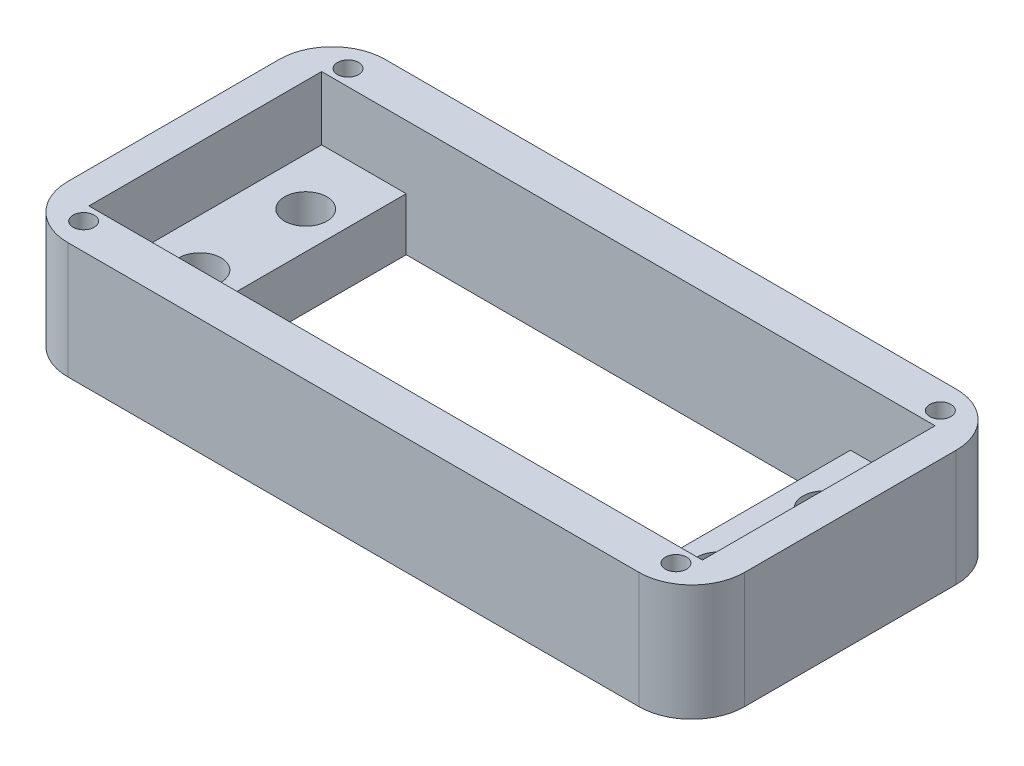
ISO-10303-21;
HEADER;
FILE_DESCRIPTION(('STEP AP214'),'2;1');
FILE_NAME('part.step','',(''),(''),'','','');
FILE_SCHEMA(('AUTOMOTIVE_DESIGN { 1 0 10303 214 1 1 1 1 }'));
ENDSEC;
DATA;
#1=APPLICATION_CONTEXT('core data for automotive mechanical design processes');
#2=APPLICATION_PROTOCOL_DEFINITION('international standard','automotive_design',2000,#1);
#3=PRODUCT_CONTEXT('',#1,'mechanical');
#4=PRODUCT('Part','Part','',(#3));
#5=PRODUCT_RELATED_PRODUCT_CATEGORY('part','',(#4));
#6=PRODUCT_DEFINITION_FORMATION('','',#4);
#7=PRODUCT_DEFINITION_CONTEXT('part definition',#1,'design');
#8=PRODUCT_DEFINITION('design','',#6,#7);
#9=PRODUCT_DEFINITION_SHAPE('','',#8);
#10=(LENGTH_UNIT() NAMED_UNIT(*) SI_UNIT(.MILLI.,.METRE.));
#11=(NAMED_UNIT(*) PLANE_ANGLE_UNIT() SI_UNIT($,.RADIAN.));
#12=(NAMED_UNIT(*) SI_UNIT($,.STERADIAN.) SOLID_ANGLE_UNIT());
#13=UNCERTAINTY_MEASURE_WITH_UNIT(LENGTH_MEASURE(1.E-05),#10,'distance_accuracy_value','');
#14=(GEOMETRIC_REPRESENTATION_CONTEXT(3) GLOBAL_UNCERTAINTY_ASSIGNED_CONTEXT((#13)) GLOBAL_UNIT_ASSIGNED_CONTEXT((#10,
#11,#12)) REPRESENTATION_CONTEXT('',''));
#15=CARTESIAN_POINT('',(0.,0.,0.));
#16=DIRECTION('',(0.,0.,1.));
#17=DIRECTION('',(1.,0.,0.));
#18=AXIS2_PLACEMENT_3D('',#15,#16,#17);
#19=CARTESIAN_POINT('',(0.,64.,0.));
#20=DIRECTION('',(1.,0.,0.));
#21=DIRECTION('',(0.,0.,-1.));
#22=AXIS2_PLACEMENT_3D('',#19,#20,#21);
#23=PLANE('',#22);
#24=DIRECTION('',(0.,0.,1.));
#25=VECTOR('',#24,1.);
#26=CARTESIAN_POINT('',(0.,70.,-25.));
#27=LINE('',#26,#25);
#28=CARTESIAN_POINT('',(0.,70.,-25.));
#29=VERTEX_POINT('',#28);
#30=CARTESIAN_POINT('',(0.,70.,-5.));
#31=VERTEX_POINT('',#30);
#32=EDGE_CURVE('E60',#29,#31,#27,.T.);
#33=ORIENTED_EDGE('',*,*,#32,.F.);
#34=DIRECTION('',(0.,-1.,0.));
#35=VECTOR('',#34,1.);
#36=CARTESIAN_POINT('',(0.,64.,-25.));
#37=LINE('',#36,#35);
#38=CARTESIAN_POINT('',(0.,59.,-25.));
#39=VERTEX_POINT('',#38);
#40=EDGE_CURVE('E53',#29,#39,#37,.T.);
#41=ORIENTED_EDGE('',*,*,#40,.T.);
#42=DIRECTION('',(0.,0.,1.));
#43=VECTOR('',#42,1.);
#44=CARTESIAN_POINT('',(0.,59.,-5.));
#45=LINE('',#44,#43);
#46=CARTESIAN_POINT('',(0.,59.,-5.));
#47=VERTEX_POINT('',#46);
#48=EDGE_CURVE('E198',#39,#47,#45,.T.);
#49=ORIENTED_EDGE('',*,*,#48,.T.);
#50=DIRECTION('',(0.,-1.,0.));
#51=VECTOR('',#50,1.);
#52=CARTESIAN_POINT('',(0.,64.,-5.));
#53=LINE('',#52,#51);
#54=EDGE_CURVE('E192',#47,#31,#53,.F.);
#55=ORIENTED_EDGE('',*,*,#54,.T.);
#56=EDGE_LOOP('',(#33,#41,#49,#55));
#57=FACE_BOUND('',#56,.T.);
#58=ADVANCED_FACE('F45',(#57),#23,.F.);
#59=CARTESIAN_POINT('',(0.,64.,0.));
#60=DIRECTION('',(0.,0.,-1.));
#61=DIRECTION('',(-1.,0.,0.));
#62=AXIS2_PLACEMENT_3D('',#59,#60,#61);
#63=PLANE('',#62);
#64=DIRECTION('',(1.,0.,0.));
#65=VECTOR('',#64,1.);
#66=CARTESIAN_POINT('',(5.,70.,0.));
#67=LINE('',#66,#65);
#68=CARTESIAN_POINT('',(5.,70.,0.));
#69=VERTEX_POINT('',#68);
#70=CARTESIAN_POINT('',(59.,70.,0.));
#71=VERTEX_POINT('',#70);
#72=EDGE_CURVE('E162',#69,#71,#67,.T.);
#73=ORIENTED_EDGE('',*,*,#72,.F.);
#74=DIRECTION('',(0.,-1.,0.));
#75=VECTOR('',#74,1.);
#76=CARTESIAN_POINT('',(5.,64.,0.));
#77=LINE('',#76,#75);
#78=CARTESIAN_POINT('',(5.,59.,0.));
#79=VERTEX_POINT('',#78);
#80=EDGE_CURVE('E183',#69,#79,#77,.T.);
#81=ORIENTED_EDGE('',*,*,#80,.T.);
#82=DIRECTION('',(1.,0.,0.));
#83=VECTOR('',#82,1.);
#84=CARTESIAN_POINT('',(59.,59.,0.));
#85=LINE('',#84,#83);
#86=CARTESIAN_POINT('',(59.,59.,0.));
#87=VERTEX_POINT('',#86);
#88=EDGE_CURVE('E369',#79,#87,#85,.T.);
#89=ORIENTED_EDGE('',*,*,#88,.T.);
#90=DIRECTION('',(0.,-1.,0.));
#91=VECTOR('',#90,1.);
#92=CARTESIAN_POINT('',(59.,64.,0.));
#93=LINE('',#92,#91);
#94=EDGE_CURVE('E190',#87,#71,#93,.F.);
#95=ORIENTED_EDGE('',*,*,#94,.T.);
#96=EDGE_LOOP('',(#73,#81,#89,#95));
#97=FACE_BOUND('',#96,.T.);
#98=ADVANCED_FACE('F384',(#97),#63,.F.);
#99=CARTESIAN_POINT('',(64.,64.,0.));
#100=DIRECTION('',(-1.,0.,0.));
#101=DIRECTION('',(0.,0.,1.));
#102=AXIS2_PLACEMENT_3D('',#99,#100,#101);
#103=PLANE('',#102);
#104=DIRECTION('',(0.,0.,-1.));
#105=VECTOR('',#104,1.);
#106=CARTESIAN_POINT('',(64.,70.,-5.));
#107=LINE('',#106,#105);
#108=CARTESIAN_POINT('',(64.,70.,-5.));
#109=VERTEX_POINT('',#108);
#110=CARTESIAN_POINT('',(64.,70.,-25.));
#111=VERTEX_POINT('',#110);
#112=EDGE_CURVE('E159',#109,#111,#107,.T.);
#113=ORIENTED_EDGE('',*,*,#112,.F.);
#114=DIRECTION('',(0.,-1.,0.));
#115=VECTOR('',#114,1.);
#116=CARTESIAN_POINT('',(64.,64.,-5.));
#117=LINE('',#116,#115);
#118=CARTESIAN_POINT('',(64.,59.,-5.));
#119=VERTEX_POINT('',#118);
#120=EDGE_CURVE('E172',#109,#119,#117,.T.);
#121=ORIENTED_EDGE('',*,*,#120,.T.);
#122=DIRECTION('',(0.,0.,-1.));
#123=VECTOR('',#122,1.);
#124=CARTESIAN_POINT('',(64.,59.,-25.));
#125=LINE('',#124,#123);
#126=CARTESIAN_POINT('',(64.,59.,-25.));
#127=VERTEX_POINT('',#126);
#128=EDGE_CURVE('E366',#119,#127,#125,.T.);
#129=ORIENTED_EDGE('',*,*,#128,.T.);
#130=DIRECTION('',(0.,-1.,0.));
#131=VECTOR('',#130,1.);
#132=CARTESIAN_POINT('',(64.,64.,-25.));
#133=LINE('',#132,#131);
#134=EDGE_CURVE('E175',#127,#111,#133,.F.);
#135=ORIENTED_EDGE('',*,*,#134,.T.);
#136=EDGE_LOOP('',(#113,#121,#129,#135));
#137=FACE_BOUND('',#136,.T.);
#138=ADVANCED_FACE('F170',(#137),#103,.F.);
#139=CARTESIAN_POINT('',(0.,64.,-30.));
#140=DIRECTION('',(0.,0.,1.));
#141=DIRECTION('',(1.,0.,0.));
#142=AXIS2_PLACEMENT_3D('',#139,#140,#141);
#143=PLANE('',#142);
#144=DIRECTION('',(-1.,0.,0.));
#145=VECTOR('',#144,1.);
#146=CARTESIAN_POINT('',(59.,70.,-30.));
#147=LINE('',#146,#145);
#148=CARTESIAN_POINT('',(59.,70.,-30.));
#149=VERTEX_POINT('',#148);
#150=CARTESIAN_POINT('',(5.,70.,-30.));
#151=VERTEX_POINT('',#150);
#152=EDGE_CURVE('E377',#149,#151,#147,.T.);
#153=ORIENTED_EDGE('',*,*,#152,.F.);
#154=DIRECTION('',(0.,-1.,0.));
#155=VECTOR('',#154,1.);
#156=CARTESIAN_POINT('',(59.,64.,-30.));
#157=LINE('',#156,#155);
#158=CARTESIAN_POINT('',(59.,59.,-30.));
#159=VERTEX_POINT('',#158);
#160=EDGE_CURVE('E181',#149,#159,#157,.T.);
#161=ORIENTED_EDGE('',*,*,#160,.T.);
#162=DIRECTION('',(-1.,0.,0.));
#163=VECTOR('',#162,1.);
#164=CARTESIAN_POINT('',(5.,59.,-30.));
#165=LINE('',#164,#163);
#166=CARTESIAN_POINT('',(5.,59.,-30.));
#167=VERTEX_POINT('',#166);
#168=EDGE_CURVE('E216',#159,#167,#165,.T.);
#169=ORIENTED_EDGE('',*,*,#168,.T.);
#170=DIRECTION('',(0.,-1.,0.));
#171=VECTOR('',#170,1.);
#172=CARTESIAN_POINT('',(5.,64.,-30.));
#173=LINE('',#172,#171);
#174=EDGE_CURVE('E185',#167,#151,#173,.F.);
#175=ORIENTED_EDGE('',*,*,#174,.T.);
#176=EDGE_LOOP('',(#153,#161,#169,#175));
#177=FACE_BOUND('',#176,.T.);
#178=ADVANCED_FACE('F381',(#177),#143,.F.);
#179=CARTESIAN_POINT('',(11.,-0.001000000000001,-26.));
#180=DIRECTION('',(0.,0.,-1.));
#181=DIRECTION('',(-1.,0.,0.));
#182=AXIS2_PLACEMENT_3D('',#179,#180,#181);
#183=PLANE('',#182);
#184=DIRECTION('',(1.,0.,0.));
#185=VECTOR('',#184,1.);
#186=CARTESIAN_POINT('',(11.,70.,-26.));
#187=LINE('',#186,#185);
#188=CARTESIAN_POINT('',(3.,70.,-26.));
#189=VERTEX_POINT('',#188);
#190=CARTESIAN_POINT('',(61.,70.,-26.));
#191=VERTEX_POINT('',#190);
#192=EDGE_CURVE('E68',#189,#191,#187,.T.);
#193=ORIENTED_EDGE('',*,*,#192,.F.);
#194=DIRECTION('',(0.,-1.,0.));
#195=VECTOR('',#194,1.);
#196=CARTESIAN_POINT('',(3.,76.,-26.));
#197=LINE('',#196,#195);
#198=CARTESIAN_POINT('',(3.,64.,-26.));
#199=VERTEX_POINT('',#198);
#200=EDGE_CURVE('E266',#189,#199,#197,.T.);
#201=ORIENTED_EDGE('',*,*,#200,.T.);
#202=DIRECTION('',(-1.,0.,0.));
#203=VECTOR('',#202,1.);
#204=CARTESIAN_POINT('',(3.,64.,-26.));
#205=LINE('',#204,#203);
#206=CARTESIAN_POINT('',(11.,64.,-26.));
#207=VERTEX_POINT('',#206);
#208=EDGE_CURVE('E267',#207,#199,#205,.T.);
#209=ORIENTED_EDGE('',*,*,#208,.F.);
#210=DIRECTION('',(0.,1.,0.));
#211=VECTOR('',#210,1.);
#212=CARTESIAN_POINT('',(11.,-0.001000000000001,-26.));
#213=LINE('',#212,#211);
#214=CARTESIAN_POINT('',(11.,59.,-26.));
#215=VERTEX_POINT('',#214);
#216=EDGE_CURVE('E294',#215,#207,#213,.T.);
#217=ORIENTED_EDGE('',*,*,#216,.F.);
#218=DIRECTION('',(-1.,0.,0.));
#219=VECTOR('',#218,1.);
#220=CARTESIAN_POINT('',(11.,59.,-26.));
#221=LINE('',#220,#219);
#222=CARTESIAN_POINT('',(53.,59.,-26.));
#223=VERTEX_POINT('',#222);
#224=EDGE_CURVE('E249',#223,#215,#221,.T.);
#225=ORIENTED_EDGE('',*,*,#224,.F.);
#226=DIRECTION('',(0.,1.,0.));
#227=VECTOR('',#226,1.);
#228=CARTESIAN_POINT('',(53.,-0.001000000000001,-26.));
#229=LINE('',#228,#227);
#230=CARTESIAN_POINT('',(53.,64.,-26.));
#231=VERTEX_POINT('',#230);
#232=EDGE_CURVE('E296',#223,#231,#229,.T.);
#233=ORIENTED_EDGE('',*,*,#232,.T.);
#234=CARTESIAN_POINT('',(61.,64.,-26.));
#235=VERTEX_POINT('',#234);
#236=EDGE_CURVE('E263',#235,#231,#205,.T.);
#237=ORIENTED_EDGE('',*,*,#236,.F.);
#238=DIRECTION('',(0.,-1.,0.));
#239=VECTOR('',#238,1.);
#240=CARTESIAN_POINT('',(61.,76.,-26.));
#241=LINE('',#240,#239);
#242=EDGE_CURVE('E269',#191,#235,#241,.T.);
#243=ORIENTED_EDGE('',*,*,#242,.F.);
#244=EDGE_LOOP('',(#193,#201,#209,#217,#225,#233,#237,#243));
#245=FACE_BOUND('',#244,.T.);
#246=ADVANCED_FACE('F314',(#245),#183,.F.);
#247=CARTESIAN_POINT('',(11.,-0.001000000000001,-4.));
#248=DIRECTION('',(0.,0.,1.));
#249=DIRECTION('',(1.,0.,0.));
#250=AXIS2_PLACEMENT_3D('',#247,#248,#249);
#251=PLANE('',#250);
#252=DIRECTION('',(-1.,0.,0.));
#253=VECTOR('',#252,1.);
#254=CARTESIAN_POINT('',(11.,70.,-4.));
#255=LINE('',#254,#253);
#256=CARTESIAN_POINT('',(61.,70.,-4.));
#257=VERTEX_POINT('',#256);
#258=CARTESIAN_POINT('',(3.,70.,-4.));
#259=VERTEX_POINT('',#258);
#260=EDGE_CURVE('E343',#257,#259,#255,.T.);
#261=ORIENTED_EDGE('',*,*,#260,.F.);
#262=DIRECTION('',(0.,-1.,0.));
#263=VECTOR('',#262,1.);
#264=CARTESIAN_POINT('',(61.,76.,-4.));
#265=LINE('',#264,#263);
#266=CARTESIAN_POINT('',(61.,64.,-4.));
#267=VERTEX_POINT('',#266);
#268=EDGE_CURVE('E271',#257,#267,#265,.T.);
#269=ORIENTED_EDGE('',*,*,#268,.T.);
#270=DIRECTION('',(1.,0.,0.));
#271=VECTOR('',#270,1.);
#272=CARTESIAN_POINT('',(3.,64.,-4.));
#273=LINE('',#272,#271);
#274=CARTESIAN_POINT('',(53.,64.,-4.));
#275=VERTEX_POINT('',#274);
#276=EDGE_CURVE('E260',#275,#267,#273,.T.);
#277=ORIENTED_EDGE('',*,*,#276,.F.);
#278=DIRECTION('',(0.,1.,0.));
#279=VECTOR('',#278,1.);
#280=CARTESIAN_POINT('',(53.,-0.001000000000001,-4.));
#281=LINE('',#280,#279);
#282=CARTESIAN_POINT('',(53.,59.,-4.));
#283=VERTEX_POINT('',#282);
#284=EDGE_CURVE('E298',#283,#275,#281,.T.);
#285=ORIENTED_EDGE('',*,*,#284,.F.);
#286=DIRECTION('',(1.,0.,0.));
#287=VECTOR('',#286,1.);
#288=CARTESIAN_POINT('',(11.,59.,-4.));
#289=LINE('',#288,#287);
#290=CARTESIAN_POINT('',(11.,59.,-4.));
#291=VERTEX_POINT('',#290);
#292=EDGE_CURVE('E245',#291,#283,#289,.T.);
#293=ORIENTED_EDGE('',*,*,#292,.F.);
#294=DIRECTION('',(0.,1.,0.));
#295=VECTOR('',#294,1.);
#296=CARTESIAN_POINT('',(11.,-0.001000000000001,-4.));
#297=LINE('',#296,#295);
#298=CARTESIAN_POINT('',(11.,64.,-4.));
#299=VERTEX_POINT('',#298);
#300=EDGE_CURVE('E293',#291,#299,#297,.T.);
#301=ORIENTED_EDGE('',*,*,#300,.T.);
#302=CARTESIAN_POINT('',(3.,64.,-4.));
#303=VERTEX_POINT('',#302);
#304=EDGE_CURVE('E256',#303,#299,#273,.T.);
#305=ORIENTED_EDGE('',*,*,#304,.F.);
#306=DIRECTION('',(0.,-1.,0.));
#307=VECTOR('',#306,1.);
#308=CARTESIAN_POINT('',(3.,76.,-4.));
#309=LINE('',#308,#307);
#310=EDGE_CURVE('E273',#259,#303,#309,.T.);
#311=ORIENTED_EDGE('',*,*,#310,.F.);
#312=EDGE_LOOP('',(#261,#269,#277,#285,#293,#301,#305,#311));
#313=FACE_BOUND('',#312,.T.);
#314=ADVANCED_FACE('F326',(#313),#251,.F.);
#315=CARTESIAN_POINT('',(4.,-0.001000000000001,-27.5));
#316=DIRECTION('',(0.,1.,0.));
#317=DIRECTION('',(0.,0.,1.));
#318=AXIS2_PLACEMENT_3D('',#315,#316,#317);
#319=CYLINDRICAL_SURFACE('',#318,1.);
#320=CARTESIAN_POINT('',(4.,59.,-27.5));
#321=DIRECTION('',(0.,-1.,0.));
#322=DIRECTION('',(0.,0.,-1.));
#323=AXIS2_PLACEMENT_3D('',#320,#321,#322);
#324=CIRCLE('',#323,1.);
#325=CARTESIAN_POINT('',(4.,59.,-28.5));
#326=VERTEX_POINT('',#325);
#327=EDGE_CURVE('E230',#326,#326,#324,.F.);
#328=ORIENTED_EDGE('',*,*,#327,.F.);
#329=EDGE_LOOP('',(#328));
#330=FACE_BOUND('',#329,.T.);
#331=CARTESIAN_POINT('',(4.,70.,-27.5));
#332=DIRECTION('',(0.,1.,0.));
#333=DIRECTION('',(0.,0.,1.));
#334=AXIS2_PLACEMENT_3D('',#331,#332,#333);
#335=CIRCLE('',#334,1.);
#336=CARTESIAN_POINT('',(4.,70.,-26.5));
#337=VERTEX_POINT('',#336);
#338=EDGE_CURVE('E360',#337,#337,#335,.F.);
#339=ORIENTED_EDGE('',*,*,#338,.F.);
#340=EDGE_LOOP('',(#339));
#341=FACE_BOUND('',#340,.T.);
#342=ADVANCED_FACE('F435',(#330,#341),#319,.F.);
#343=CARTESIAN_POINT('',(4.00000000000001,-0.001000000000001,-2.5));
#344=DIRECTION('',(0.,1.,0.));
#345=DIRECTION('',(0.,0.,1.));
#346=AXIS2_PLACEMENT_3D('',#343,#344,#345);
#347=CYLINDRICAL_SURFACE('',#346,1.);
#348=CARTESIAN_POINT('',(4.00000000000001,59.,-2.5));
#349=DIRECTION('',(0.,-1.,0.));
#350=DIRECTION('',(0.,0.,-1.));
#351=AXIS2_PLACEMENT_3D('',#348,#349,#350);
#352=CIRCLE('',#351,1.);
#353=CARTESIAN_POINT('',(4.00000000000001,59.,-3.5));
#354=VERTEX_POINT('',#353);
#355=EDGE_CURVE('E227',#354,#354,#352,.F.);
#356=ORIENTED_EDGE('',*,*,#355,.F.);
#357=EDGE_LOOP('',(#356));
#358=FACE_BOUND('',#357,.T.);
#359=CARTESIAN_POINT('',(4.00000000000001,70.,-2.5));
#360=DIRECTION('',(0.,1.,0.));
#361=DIRECTION('',(0.,0.,1.));
#362=AXIS2_PLACEMENT_3D('',#359,#360,#361);
#363=CIRCLE('',#362,1.);
#364=CARTESIAN_POINT('',(4.00000000000001,70.,-1.5));
#365=VERTEX_POINT('',#364);
#366=EDGE_CURVE('E357',#365,#365,#363,.F.);
#367=ORIENTED_EDGE('',*,*,#366,.F.);
#368=EDGE_LOOP('',(#367));
#369=FACE_BOUND('',#368,.T.);
#370=ADVANCED_FACE('F463',(#358,#369),#347,.F.);
#371=CARTESIAN_POINT('',(60.,-0.001000000000001,-2.50000000000001));
#372=DIRECTION('',(0.,1.,0.));
#373=DIRECTION('',(0.,0.,1.));
#374=AXIS2_PLACEMENT_3D('',#371,#372,#373);
#375=CYLINDRICAL_SURFACE('',#374,0.999999999999998);
#376=CARTESIAN_POINT('',(60.,59.,-2.50000000000001));
#377=DIRECTION('',(0.,-1.,0.));
#378=DIRECTION('',(0.,0.,-1.));
#379=AXIS2_PLACEMENT_3D('',#376,#377,#378);
#380=CIRCLE('',#379,0.999999999999998);
#381=CARTESIAN_POINT('',(60.,59.,-3.5));
#382=VERTEX_POINT('',#381);
#383=EDGE_CURVE('E224',#382,#382,#380,.F.);
#384=ORIENTED_EDGE('',*,*,#383,.F.);
#385=EDGE_LOOP('',(#384));
#386=FACE_BOUND('',#385,.T.);
#387=CARTESIAN_POINT('',(60.,70.,-2.50000000000001));
#388=DIRECTION('',(0.,1.,0.));
#389=DIRECTION('',(0.,0.,1.));
#390=AXIS2_PLACEMENT_3D('',#387,#388,#389);
#391=CIRCLE('',#390,0.999999999999998);
#392=CARTESIAN_POINT('',(60.,70.,-1.50000000000001));
#393=VERTEX_POINT('',#392);
#394=EDGE_CURVE('E354',#393,#393,#391,.F.);
#395=ORIENTED_EDGE('',*,*,#394,.F.);
#396=EDGE_LOOP('',(#395));
#397=FACE_BOUND('',#396,.T.);
#398=ADVANCED_FACE('F471',(#386,#397),#375,.F.);
#399=CARTESIAN_POINT('',(60.,-0.001000000000001,-27.5));
#400=DIRECTION('',(0.,1.,0.));
#401=DIRECTION('',(0.,0.,1.));
#402=AXIS2_PLACEMENT_3D('',#399,#400,#401);
#403=CYLINDRICAL_SURFACE('',#402,0.999999999999998);
#404=CARTESIAN_POINT('',(60.,59.,-27.5));
#405=DIRECTION('',(0.,-1.,0.));
#406=DIRECTION('',(0.,0.,-1.));
#407=AXIS2_PLACEMENT_3D('',#404,#405,#406);
#408=CIRCLE('',#407,0.999999999999998);
#409=CARTESIAN_POINT('',(60.,59.,-28.5));
#410=VERTEX_POINT('',#409);
#411=EDGE_CURVE('E218',#410,#410,#408,.F.);
#412=ORIENTED_EDGE('',*,*,#411,.F.);
#413=EDGE_LOOP('',(#412));
#414=FACE_BOUND('',#413,.T.);
#415=CARTESIAN_POINT('',(60.,70.,-27.5));
#416=DIRECTION('',(0.,1.,0.));
#417=DIRECTION('',(0.,0.,1.));
#418=AXIS2_PLACEMENT_3D('',#415,#416,#417);
#419=CIRCLE('',#418,0.999999999999998);
#420=CARTESIAN_POINT('',(60.,70.,-26.5));
#421=VERTEX_POINT('',#420);
#422=EDGE_CURVE('E351',#421,#421,#419,.F.);
#423=ORIENTED_EDGE('',*,*,#422,.F.);
#424=EDGE_LOOP('',(#423));
#425=FACE_BOUND('',#424,.T.);
#426=ADVANCED_FACE('F397',(#414,#425),#403,.F.);
#427=CARTESIAN_POINT('',(59.,64.,-25.));
#428=DIRECTION('',(0.,-1.,0.));
#429=DIRECTION('',(0.,0.,-1.));
#430=AXIS2_PLACEMENT_3D('',#427,#428,#429);
#431=CYLINDRICAL_SURFACE('',#430,5.);
#432=ORIENTED_EDGE('',*,*,#160,.F.);
#433=CARTESIAN_POINT('',(59.,70.,-25.));
#434=DIRECTION('',(0.,1.,0.));
#435=DIRECTION('',(0.,0.,1.));
#436=AXIS2_PLACEMENT_3D('',#433,#434,#435);
#437=CIRCLE('',#436,5.);
#438=EDGE_CURVE('E176',#111,#149,#437,.T.);
#439=ORIENTED_EDGE('',*,*,#438,.F.);
#440=ORIENTED_EDGE('',*,*,#134,.F.);
#441=CARTESIAN_POINT('',(59.,59.,-25.));
#442=DIRECTION('',(0.,-1.,0.));
#443=DIRECTION('',(0.,0.,-1.));
#444=AXIS2_PLACEMENT_3D('',#441,#442,#443);
#445=CIRCLE('',#444,5.);
#446=EDGE_CURVE('E363',#127,#159,#445,.F.);
#447=ORIENTED_EDGE('',*,*,#446,.T.);
#448=EDGE_LOOP('',(#432,#439,#440,#447));
#449=FACE_BOUND('',#448,.T.);
#450=ADVANCED_FACE('F382',(#449),#431,.T.);
#451=CARTESIAN_POINT('',(59.,64.,-5.));
#452=DIRECTION('',(0.,-1.,0.));
#453=DIRECTION('',(0.,0.,-1.));
#454=AXIS2_PLACEMENT_3D('',#451,#452,#453);
#455=CYLINDRICAL_SURFACE('',#454,5.);
#456=ORIENTED_EDGE('',*,*,#120,.F.);
#457=CARTESIAN_POINT('',(59.,70.,-5.));
#458=DIRECTION('',(0.,1.,0.));
#459=DIRECTION('',(0.,0.,1.));
#460=AXIS2_PLACEMENT_3D('',#457,#458,#459);
#461=CIRCLE('',#460,5.);
#462=EDGE_CURVE('E155',#71,#109,#461,.T.);
#463=ORIENTED_EDGE('',*,*,#462,.F.);
#464=ORIENTED_EDGE('',*,*,#94,.F.);
#465=CARTESIAN_POINT('',(59.,59.,-5.));
#466=DIRECTION('',(0.,-1.,0.));
#467=DIRECTION('',(0.,0.,-1.));
#468=AXIS2_PLACEMENT_3D('',#465,#466,#467);
#469=CIRCLE('',#468,5.);
#470=EDGE_CURVE('E180',#87,#119,#469,.F.);
#471=ORIENTED_EDGE('',*,*,#470,.T.);
#472=EDGE_LOOP('',(#456,#463,#464,#471));
#473=FACE_BOUND('',#472,.T.);
#474=ADVANCED_FACE('F179',(#473),#455,.T.);
#475=CARTESIAN_POINT('',(5.,64.,-25.));
#476=DIRECTION('',(0.,-1.,0.));
#477=DIRECTION('',(0.,0.,-1.));
#478=AXIS2_PLACEMENT_3D('',#475,#476,#477);
#479=CYLINDRICAL_SURFACE('',#478,5.);
#480=ORIENTED_EDGE('',*,*,#40,.F.);
#481=CARTESIAN_POINT('',(5.,70.,-25.));
#482=DIRECTION('',(0.,1.,0.));
#483=DIRECTION('',(0.,0.,1.));
#484=AXIS2_PLACEMENT_3D('',#481,#482,#483);
#485=CIRCLE('',#484,5.);
#486=EDGE_CURVE('E373',#151,#29,#485,.T.);
#487=ORIENTED_EDGE('',*,*,#486,.F.);
#488=ORIENTED_EDGE('',*,*,#174,.F.);
#489=CARTESIAN_POINT('',(5.,59.,-25.));
#490=DIRECTION('',(0.,-1.,0.));
#491=DIRECTION('',(0.,0.,-1.));
#492=AXIS2_PLACEMENT_3D('',#489,#490,#491);
#493=CIRCLE('',#492,5.);
#494=EDGE_CURVE('E207',#167,#39,#493,.F.);
#495=ORIENTED_EDGE('',*,*,#494,.T.);
#496=EDGE_LOOP('',(#480,#487,#488,#495));
#497=FACE_BOUND('',#496,.T.);
#498=ADVANCED_FACE('F214',(#497),#479,.T.);
#499=CARTESIAN_POINT('',(5.,64.,-5.));
#500=DIRECTION('',(0.,-1.,0.));
#501=DIRECTION('',(0.,0.,-1.));
#502=AXIS2_PLACEMENT_3D('',#499,#500,#501);
#503=CYLINDRICAL_SURFACE('',#502,5.);
#504=ORIENTED_EDGE('',*,*,#80,.F.);
#505=CARTESIAN_POINT('',(5.,70.,-5.));
#506=DIRECTION('',(0.,1.,0.));
#507=DIRECTION('',(0.,0.,1.));
#508=AXIS2_PLACEMENT_3D('',#505,#506,#507);
#509=CIRCLE('',#508,5.);
#510=EDGE_CURVE('E346',#31,#69,#509,.T.);
#511=ORIENTED_EDGE('',*,*,#510,.F.);
#512=ORIENTED_EDGE('',*,*,#54,.F.);
#513=CARTESIAN_POINT('',(5.,59.,-5.));
#514=DIRECTION('',(0.,-1.,0.));
#515=DIRECTION('',(0.,0.,-1.));
#516=AXIS2_PLACEMENT_3D('',#513,#514,#515);
#517=CIRCLE('',#516,5.);
#518=EDGE_CURVE('E211',#47,#79,#517,.F.);
#519=ORIENTED_EDGE('',*,*,#518,.T.);
#520=EDGE_LOOP('',(#504,#511,#512,#519));
#521=FACE_BOUND('',#520,.T.);
#522=ADVANCED_FACE('F47',(#521),#503,.T.);
#523=CARTESIAN_POINT('',(3.,76.,-4.));
#524=DIRECTION('',(1.,0.,0.));
#525=DIRECTION('',(0.,0.,-1.));
#526=AXIS2_PLACEMENT_3D('',#523,#524,#525);
#527=PLANE('',#526);
#528=ORIENTED_EDGE('',*,*,#200,.F.);
#529=DIRECTION('',(0.,0.,1.));
#530=VECTOR('',#529,1.);
#531=CARTESIAN_POINT('',(3.,70.,-4.));
#532=LINE('',#531,#530);
#533=EDGE_CURVE('E323',#189,#259,#532,.T.);
#534=ORIENTED_EDGE('',*,*,#533,.T.);
#535=ORIENTED_EDGE('',*,*,#310,.T.);
#536=DIRECTION('',(0.,0.,1.));
#537=VECTOR('',#536,1.);
#538=CARTESIAN_POINT('',(3.,64.,-4.));
#539=LINE('',#538,#537);
#540=EDGE_CURVE('E253',#199,#303,#539,.T.);
#541=ORIENTED_EDGE('',*,*,#540,.F.);
#542=EDGE_LOOP('',(#528,#534,#535,#541));
#543=FACE_BOUND('',#542,.T.);
#544=ADVANCED_FACE('F320',(#543),#527,.T.);
#545=CARTESIAN_POINT('',(61.,76.,-26.));
#546=DIRECTION('',(-1.,0.,0.));
#547=DIRECTION('',(0.,0.,1.));
#548=AXIS2_PLACEMENT_3D('',#545,#546,#547);
#549=PLANE('',#548);
#550=ORIENTED_EDGE('',*,*,#268,.F.);
#551=DIRECTION('',(0.,0.,-1.));
#552=VECTOR('',#551,1.);
#553=CARTESIAN_POINT('',(61.,70.,-26.));
#554=LINE('',#553,#552);
#555=EDGE_CURVE('E12',#257,#191,#554,.T.);
#556=ORIENTED_EDGE('',*,*,#555,.T.);
#557=ORIENTED_EDGE('',*,*,#242,.T.);
#558=DIRECTION('',(0.,0.,-1.));
#559=VECTOR('',#558,1.);
#560=CARTESIAN_POINT('',(61.,64.,-26.));
#561=LINE('',#560,#559);
#562=EDGE_CURVE('E259',#267,#235,#561,.T.);
#563=ORIENTED_EDGE('',*,*,#562,.F.);
#564=EDGE_LOOP('',(#550,#556,#557,#563));
#565=FACE_BOUND('',#564,.T.);
#566=ADVANCED_FACE('F342',(#565),#549,.T.);
#567=CARTESIAN_POINT('',(11.,-0.001000000000001,-26.));
#568=DIRECTION('',(-1.,0.,0.));
#569=DIRECTION('',(0.,0.,1.));
#570=AXIS2_PLACEMENT_3D('',#567,#568,#569);
#571=PLANE('',#570);
#572=DIRECTION('',(0.,0.,1.));
#573=VECTOR('',#572,1.);
#574=CARTESIAN_POINT('',(11.,59.,-26.));
#575=LINE('',#574,#573);
#576=EDGE_CURVE('E251',#215,#291,#575,.T.);
#577=ORIENTED_EDGE('',*,*,#576,.F.);
#578=ORIENTED_EDGE('',*,*,#216,.T.);
#579=DIRECTION('',(0.,0.,1.));
#580=VECTOR('',#579,1.);
#581=CARTESIAN_POINT('',(11.,64.,-26.));
#582=LINE('',#581,#580);
#583=EDGE_CURVE('E287',#207,#299,#582,.T.);
#584=ORIENTED_EDGE('',*,*,#583,.T.);
#585=ORIENTED_EDGE('',*,*,#300,.F.);
#586=EDGE_LOOP('',(#577,#578,#584,#585));
#587=FACE_BOUND('',#586,.T.);
#588=ADVANCED_FACE('F331',(#587),#571,.F.);
#589=CARTESIAN_POINT('',(53.,-0.001000000000001,-26.));
#590=DIRECTION('',(1.,0.,0.));
#591=DIRECTION('',(0.,0.,-1.));
#592=AXIS2_PLACEMENT_3D('',#589,#590,#591);
#593=PLANE('',#592);
#594=DIRECTION('',(0.,0.,-1.));
#595=VECTOR('',#594,1.);
#596=CARTESIAN_POINT('',(53.,59.,-26.));
#597=LINE('',#596,#595);
#598=EDGE_CURVE('E247',#283,#223,#597,.T.);
#599=ORIENTED_EDGE('',*,*,#598,.F.);
#600=ORIENTED_EDGE('',*,*,#284,.T.);
#601=DIRECTION('',(0.,0.,-1.));
#602=VECTOR('',#601,1.);
#603=CARTESIAN_POINT('',(53.,64.,-26.));
#604=LINE('',#603,#602);
#605=EDGE_CURVE('E290',#275,#231,#604,.T.);
#606=ORIENTED_EDGE('',*,*,#605,.T.);
#607=ORIENTED_EDGE('',*,*,#232,.F.);
#608=EDGE_LOOP('',(#599,#600,#606,#607));
#609=FACE_BOUND('',#608,.T.);
#610=ADVANCED_FACE('F335',(#609),#593,.F.);
#611=CARTESIAN_POINT('',(7.5,-0.001000000000001,-20.));
#612=DIRECTION('',(0.,1.,0.));
#613=DIRECTION('',(0.,0.,1.));
#614=AXIS2_PLACEMENT_3D('',#611,#612,#613);
#615=CYLINDRICAL_SURFACE('',#614,2.);
#616=CARTESIAN_POINT('',(7.5,64.,-20.));
#617=DIRECTION('',(0.,1.,0.));
#618=DIRECTION('',(0.,0.,1.));
#619=AXIS2_PLACEMENT_3D('',#616,#617,#618);
#620=CIRCLE('',#619,2.);
#621=CARTESIAN_POINT('',(7.5,64.,-18.));
#622=VERTEX_POINT('',#621);
#623=EDGE_CURVE('E279',#622,#622,#620,.T.);
#624=ORIENTED_EDGE('',*,*,#623,.T.);
#625=EDGE_LOOP('',(#624));
#626=FACE_BOUND('',#625,.T.);
#627=CARTESIAN_POINT('',(7.5,59.,-20.));
#628=DIRECTION('',(0.,-1.,0.));
#629=DIRECTION('',(0.,0.,-1.));
#630=AXIS2_PLACEMENT_3D('',#627,#628,#629);
#631=CIRCLE('',#630,2.);
#632=CARTESIAN_POINT('',(7.5,59.,-22.));
#633=VERTEX_POINT('',#632);
#634=EDGE_CURVE('E242',#633,#633,#631,.F.);
#635=ORIENTED_EDGE('',*,*,#634,.F.);
#636=EDGE_LOOP('',(#635));
#637=FACE_BOUND('',#636,.T.);
#638=ADVANCED_FACE('F417',(#626,#637),#615,.F.);
#639=CARTESIAN_POINT('',(7.5,-0.001000000000001,-10.));
#640=DIRECTION('',(0.,1.,0.));
#641=DIRECTION('',(0.,0.,1.));
#642=AXIS2_PLACEMENT_3D('',#639,#640,#641);
#643=CYLINDRICAL_SURFACE('',#642,1.99999999999999);
#644=CARTESIAN_POINT('',(7.5,64.,-10.));
#645=DIRECTION('',(0.,1.,0.));
#646=DIRECTION('',(0.,0.,-1.));
#647=AXIS2_PLACEMENT_3D('',#644,#645,#646);
#648=CIRCLE('',#647,1.99999999999999);
#649=CARTESIAN_POINT('',(7.5,64.,-12.));
#650=VERTEX_POINT('',#649);
#651=EDGE_CURVE('E276',#650,#650,#648,.T.);
#652=ORIENTED_EDGE('',*,*,#651,.T.);
#653=EDGE_LOOP('',(#652));
#654=FACE_BOUND('',#653,.T.);
#655=CARTESIAN_POINT('',(7.5,59.,-10.));
#656=DIRECTION('',(0.,-1.,0.));
#657=DIRECTION('',(0.,0.,-1.));
#658=AXIS2_PLACEMENT_3D('',#655,#656,#657);
#659=CIRCLE('',#658,1.99999999999999);
#660=CARTESIAN_POINT('',(7.5,59.,-12.));
#661=VERTEX_POINT('',#660);
#662=EDGE_CURVE('E239',#661,#661,#659,.F.);
#663=ORIENTED_EDGE('',*,*,#662,.F.);
#664=EDGE_LOOP('',(#663));
#665=FACE_BOUND('',#664,.T.);
#666=ADVANCED_FACE('F413',(#654,#665),#643,.F.);
#667=CARTESIAN_POINT('',(56.5,-0.001000000000001,-10.));
#668=DIRECTION('',(0.,1.,0.));
#669=DIRECTION('',(0.,0.,1.));
#670=AXIS2_PLACEMENT_3D('',#667,#668,#669);
#671=CYLINDRICAL_SURFACE('',#670,2.);
#672=CARTESIAN_POINT('',(56.5,64.,-10.));
#673=DIRECTION('',(0.,1.,0.));
#674=DIRECTION('',(0.,0.,1.));
#675=AXIS2_PLACEMENT_3D('',#672,#673,#674);
#676=CIRCLE('',#675,2.);
#677=CARTESIAN_POINT('',(56.5,64.,-8.));
#678=VERTEX_POINT('',#677);
#679=EDGE_CURVE('E280',#678,#678,#676,.T.);
#680=ORIENTED_EDGE('',*,*,#679,.T.);
#681=EDGE_LOOP('',(#680));
#682=FACE_BOUND('',#681,.T.);
#683=CARTESIAN_POINT('',(56.5,59.,-10.));
#684=DIRECTION('',(0.,-1.,0.));
#685=DIRECTION('',(0.,0.,-1.));
#686=AXIS2_PLACEMENT_3D('',#683,#684,#685);
#687=CIRCLE('',#686,2.);
#688=CARTESIAN_POINT('',(56.5,59.,-12.));
#689=VERTEX_POINT('',#688);
#690=EDGE_CURVE('E236',#689,#689,#687,.F.);
#691=ORIENTED_EDGE('',*,*,#690,.F.);
#692=EDGE_LOOP('',(#691));
#693=FACE_BOUND('',#692,.T.);
#694=ADVANCED_FACE('F416',(#682,#693),#671,.F.);
#695=CARTESIAN_POINT('',(56.5,-0.001000000000001,-20.));
#696=DIRECTION('',(0.,1.,0.));
#697=DIRECTION('',(0.,0.,1.));
#698=AXIS2_PLACEMENT_3D('',#695,#696,#697);
#699=CYLINDRICAL_SURFACE('',#698,2.);
#700=CARTESIAN_POINT('',(56.5,64.,-20.));
#701=DIRECTION('',(0.,1.,0.));
#702=DIRECTION('',(0.,0.,-1.));
#703=AXIS2_PLACEMENT_3D('',#700,#701,#702);
#704=CIRCLE('',#703,2.);
#705=CARTESIAN_POINT('',(56.5,64.,-22.));
#706=VERTEX_POINT('',#705);
#707=EDGE_CURVE('E275',#706,#706,#704,.T.);
#708=ORIENTED_EDGE('',*,*,#707,.T.);
#709=EDGE_LOOP('',(#708));
#710=FACE_BOUND('',#709,.T.);
#711=CARTESIAN_POINT('',(56.5,59.,-20.));
#712=DIRECTION('',(0.,-1.,0.));
#713=DIRECTION('',(0.,0.,-1.));
#714=AXIS2_PLACEMENT_3D('',#711,#712,#713);
#715=CIRCLE('',#714,2.);
#716=CARTESIAN_POINT('',(56.5,59.,-22.));
#717=VERTEX_POINT('',#716);
#718=EDGE_CURVE('E233',#717,#717,#715,.F.);
#719=ORIENTED_EDGE('',*,*,#718,.F.);
#720=EDGE_LOOP('',(#719));
#721=FACE_BOUND('',#720,.T.);
#722=ADVANCED_FACE('F421',(#710,#721),#699,.F.);
#723=CARTESIAN_POINT('',(0.,64.,0.));
#724=DIRECTION('',(0.,-1.,0.));
#725=DIRECTION('',(0.,0.,-1.));
#726=AXIS2_PLACEMENT_3D('',#723,#724,#725);
#727=PLANE('',#726);
#728=ORIENTED_EDGE('',*,*,#679,.F.);
#729=EDGE_LOOP('',(#728));
#730=FACE_BOUND('',#729,.T.);
#731=ORIENTED_EDGE('',*,*,#707,.F.);
#732=EDGE_LOOP('',(#731));
#733=FACE_BOUND('',#732,.T.);
#734=ORIENTED_EDGE('',*,*,#605,.F.);
#735=ORIENTED_EDGE('',*,*,#276,.T.);
#736=ORIENTED_EDGE('',*,*,#562,.T.);
#737=ORIENTED_EDGE('',*,*,#236,.T.);
#738=EDGE_LOOP('',(#734,#735,#736,#737));
#739=FACE_BOUND('',#738,.T.);
#740=ADVANCED_FACE('F338',(#730,#733,#739),#727,.F.);
#741=ORIENTED_EDGE('',*,*,#651,.F.);
#742=EDGE_LOOP('',(#741));
#743=FACE_BOUND('',#742,.T.);
#744=ORIENTED_EDGE('',*,*,#623,.F.);
#745=EDGE_LOOP('',(#744));
#746=FACE_BOUND('',#745,.T.);
#747=ORIENTED_EDGE('',*,*,#540,.T.);
#748=ORIENTED_EDGE('',*,*,#304,.T.);
#749=ORIENTED_EDGE('',*,*,#583,.F.);
#750=ORIENTED_EDGE('',*,*,#208,.T.);
#751=EDGE_LOOP('',(#747,#748,#749,#750));
#752=FACE_BOUND('',#751,.T.);
#753=ADVANCED_FACE('F310',(#743,#746,#752),#727,.F.);
#754=CARTESIAN_POINT('',(0.,59.,0.));
#755=DIRECTION('',(0.,-1.,0.));
#756=DIRECTION('',(0.,0.,-1.));
#757=AXIS2_PLACEMENT_3D('',#754,#755,#756);
#758=PLANE('',#757);
#759=ORIENTED_EDGE('',*,*,#634,.T.);
#760=EDGE_LOOP('',(#759));
#761=FACE_BOUND('',#760,.T.);
#762=ORIENTED_EDGE('',*,*,#662,.T.);
#763=EDGE_LOOP('',(#762));
#764=FACE_BOUND('',#763,.T.);
#765=ORIENTED_EDGE('',*,*,#690,.T.);
#766=EDGE_LOOP('',(#765));
#767=FACE_BOUND('',#766,.T.);
#768=ORIENTED_EDGE('',*,*,#718,.T.);
#769=EDGE_LOOP('',(#768));
#770=FACE_BOUND('',#769,.T.);
#771=ORIENTED_EDGE('',*,*,#327,.T.);
#772=EDGE_LOOP('',(#771));
#773=FACE_BOUND('',#772,.T.);
#774=ORIENTED_EDGE('',*,*,#355,.T.);
#775=EDGE_LOOP('',(#774));
#776=FACE_BOUND('',#775,.T.);
#777=ORIENTED_EDGE('',*,*,#383,.T.);
#778=EDGE_LOOP('',(#777));
#779=FACE_BOUND('',#778,.T.);
#780=ORIENTED_EDGE('',*,*,#411,.T.);
#781=EDGE_LOOP('',(#780));
#782=FACE_BOUND('',#781,.T.);
#783=ORIENTED_EDGE('',*,*,#494,.F.);
#784=ORIENTED_EDGE('',*,*,#168,.F.);
#785=ORIENTED_EDGE('',*,*,#446,.F.);
#786=ORIENTED_EDGE('',*,*,#128,.F.);
#787=ORIENTED_EDGE('',*,*,#470,.F.);
#788=ORIENTED_EDGE('',*,*,#88,.F.);
#789=ORIENTED_EDGE('',*,*,#518,.F.);
#790=ORIENTED_EDGE('',*,*,#48,.F.);
#791=EDGE_LOOP('',(#783,#784,#785,#786,#787,#788,#789,#790));
#792=FACE_BOUND('',#791,.T.);
#793=ORIENTED_EDGE('',*,*,#576,.T.);
#794=ORIENTED_EDGE('',*,*,#292,.T.);
#795=ORIENTED_EDGE('',*,*,#598,.T.);
#796=ORIENTED_EDGE('',*,*,#224,.T.);
#797=EDGE_LOOP('',(#793,#794,#795,#796));
#798=FACE_BOUND('',#797,.T.);
#799=ADVANCED_FACE('F204',(#761,#764,#767,#770,#773,#776,#779,#782,#792,#798),#758,.T.);
#800=CARTESIAN_POINT('',(59.,70.,-5.));
#801=DIRECTION('',(0.,1.,0.));
#802=DIRECTION('',(0.,0.,1.));
#803=AXIS2_PLACEMENT_3D('',#800,#801,#802);
#804=PLANE('',#803);
#805=ORIENTED_EDGE('',*,*,#192,.T.);
#806=ORIENTED_EDGE('',*,*,#555,.F.);
#807=ORIENTED_EDGE('',*,*,#260,.T.);
#808=ORIENTED_EDGE('',*,*,#533,.F.);
#809=EDGE_LOOP('',(#805,#806,#807,#808));
#810=FACE_BOUND('',#809,.T.);
#811=ORIENTED_EDGE('',*,*,#462,.T.);
#812=ORIENTED_EDGE('',*,*,#112,.T.);
#813=ORIENTED_EDGE('',*,*,#438,.T.);
#814=ORIENTED_EDGE('',*,*,#152,.T.);
#815=ORIENTED_EDGE('',*,*,#486,.T.);
#816=ORIENTED_EDGE('',*,*,#32,.T.);
#817=ORIENTED_EDGE('',*,*,#510,.T.);
#818=ORIENTED_EDGE('',*,*,#72,.T.);
#819=EDGE_LOOP('',(#811,#812,#813,#814,#815,#816,#817,#818));
#820=FACE_BOUND('',#819,.T.);
#821=ORIENTED_EDGE('',*,*,#422,.T.);
#822=EDGE_LOOP('',(#821));
#823=FACE_BOUND('',#822,.T.);
#824=ORIENTED_EDGE('',*,*,#394,.T.);
#825=EDGE_LOOP('',(#824));
#826=FACE_BOUND('',#825,.T.);
#827=ORIENTED_EDGE('',*,*,#366,.T.);
#828=EDGE_LOOP('',(#827));
#829=FACE_BOUND('',#828,.T.);
#830=ORIENTED_EDGE('',*,*,#338,.T.);
#831=EDGE_LOOP('',(#830));
#832=FACE_BOUND('',#831,.T.);
#833=ADVANCED_FACE('F157',(#810,#820,#823,#826,#829,#832),#804,.T.);
#834=CLOSED_SHELL('',(#58,#98,#138,#178,#246,#314,#342,#370,#398,#426,#450,#474,#498,#522,#544,
#566,#588,#610,#638,#666,#694,#722,#740,#753,#799,#833));
#835=MANIFOLD_SOLID_BREP('B2',#834);
#836=ADVANCED_BREP_SHAPE_REPRESENTATION('',(#18,#835),#14);
#837=SHAPE_DEFINITION_REPRESENTATION(#9,#836);
ENDSEC;
END-ISO-10303-21;
